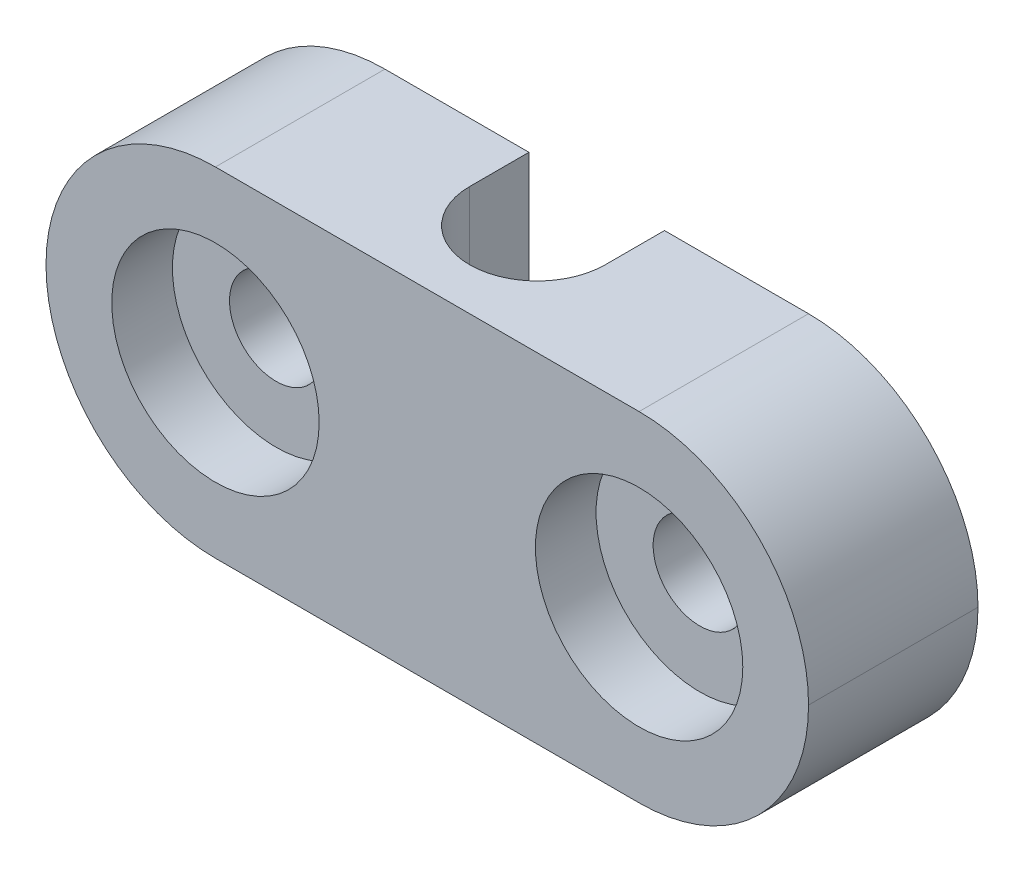
ISO-10303-21;
HEADER;
FILE_DESCRIPTION(('STEP AP214'),'2;1');
FILE_NAME('part.step','',(''),(''),'','','');
FILE_SCHEMA(('AUTOMOTIVE_DESIGN { 1 0 10303 214 1 1 1 1 }'));
ENDSEC;
DATA;
#1=APPLICATION_CONTEXT('core data for automotive mechanical design processes');
#2=APPLICATION_PROTOCOL_DEFINITION('international standard','automotive_design',2000,#1);
#3=PRODUCT_CONTEXT('',#1,'mechanical');
#4=PRODUCT('Part','Part','',(#3));
#5=PRODUCT_RELATED_PRODUCT_CATEGORY('part','',(#4));
#6=PRODUCT_DEFINITION_FORMATION('','',#4);
#7=PRODUCT_DEFINITION_CONTEXT('part definition',#1,'design');
#8=PRODUCT_DEFINITION('design','',#6,#7);
#9=PRODUCT_DEFINITION_SHAPE('','',#8);
#10=(LENGTH_UNIT() NAMED_UNIT(*) SI_UNIT(.MILLI.,.METRE.));
#11=(NAMED_UNIT(*) PLANE_ANGLE_UNIT() SI_UNIT($,.RADIAN.));
#12=(NAMED_UNIT(*) SI_UNIT($,.STERADIAN.) SOLID_ANGLE_UNIT());
#13=UNCERTAINTY_MEASURE_WITH_UNIT(LENGTH_MEASURE(1.E-05),#10,'distance_accuracy_value','');
#14=(GEOMETRIC_REPRESENTATION_CONTEXT(3) GLOBAL_UNCERTAINTY_ASSIGNED_CONTEXT((#13)) GLOBAL_UNIT_ASSIGNED_CONTEXT((#10,
#11,#12)) REPRESENTATION_CONTEXT('',''));
#15=CARTESIAN_POINT('',(0.,0.,0.));
#16=DIRECTION('',(0.,0.,1.));
#17=DIRECTION('',(1.,0.,0.));
#18=AXIS2_PLACEMENT_3D('',#15,#16,#17);
#19=CARTESIAN_POINT('',(0.,0.,0.));
#20=DIRECTION('',(0.,0.,-1.));
#21=DIRECTION('',(-1.,0.,0.));
#22=AXIS2_PLACEMENT_3D('',#19,#20,#21);
#23=PLANE('',#22);
#24=DIRECTION('',(0.,1.,0.));
#25=VECTOR('',#24,1.);
#26=CARTESIAN_POINT('',(-4.,0.,0.));
#27=LINE('',#26,#25);
#28=CARTESIAN_POINT('',(-4.,-10.,0.));
#29=VERTEX_POINT('',#28);
#30=CARTESIAN_POINT('',(-4.,10.,0.));
#31=VERTEX_POINT('',#30);
#32=EDGE_CURVE('E11',#29,#31,#27,.T.);
#33=ORIENTED_EDGE('',*,*,#32,.F.);
#34=DIRECTION('',(1.,0.,0.));
#35=VECTOR('',#34,1.);
#36=CARTESIAN_POINT('',(-22.5,-10.,0.));
#37=LINE('',#36,#35);
#38=CARTESIAN_POINT('',(-12.5,-10.,0.));
#39=VERTEX_POINT('',#38);
#40=EDGE_CURVE('E130',#39,#29,#37,.T.);
#41=ORIENTED_EDGE('',*,*,#40,.F.);
#42=CARTESIAN_POINT('',(-12.5,0.,0.));
#43=DIRECTION('',(0.,0.,-1.));
#44=DIRECTION('',(-1.,0.,0.));
#45=AXIS2_PLACEMENT_3D('',#42,#43,#44);
#46=CIRCLE('',#45,10.);
#47=CARTESIAN_POINT('',(-22.5,0.,0.));
#48=VERTEX_POINT('',#47);
#49=EDGE_CURVE('E145',#39,#48,#46,.T.);
#50=ORIENTED_EDGE('',*,*,#49,.T.);
#51=CARTESIAN_POINT('',(-12.5,0.,0.));
#52=DIRECTION('',(0.,0.,-1.));
#53=DIRECTION('',(-1.,0.,0.));
#54=AXIS2_PLACEMENT_3D('',#51,#52,#53);
#55=CIRCLE('',#54,10.);
#56=CARTESIAN_POINT('',(-12.5,10.,0.));
#57=VERTEX_POINT('',#56);
#58=EDGE_CURVE('E147',#48,#57,#55,.T.);
#59=ORIENTED_EDGE('',*,*,#58,.T.);
#60=DIRECTION('',(-1.,0.,0.));
#61=VECTOR('',#60,1.);
#62=CARTESIAN_POINT('',(-22.5,10.,0.));
#63=LINE('',#62,#61);
#64=EDGE_CURVE('E134',#31,#57,#63,.T.);
#65=ORIENTED_EDGE('',*,*,#64,.F.);
#66=EDGE_LOOP('',(#33,#41,#50,#59,#65));
#67=FACE_BOUND('',#66,.T.);
#68=CARTESIAN_POINT('',(-12.5,0.,0.));
#69=DIRECTION('',(0.,0.,1.));
#70=DIRECTION('',(1.,0.,0.));
#71=AXIS2_PLACEMENT_3D('',#68,#69,#70);
#72=CIRCLE('',#71,2.75);
#73=CARTESIAN_POINT('',(-9.75,0.,0.));
#74=VERTEX_POINT('',#73);
#75=EDGE_CURVE('E227',#74,#74,#72,.T.);
#76=ORIENTED_EDGE('',*,*,#75,.T.);
#77=EDGE_LOOP('',(#76));
#78=FACE_BOUND('',#77,.T.);
#79=ADVANCED_FACE('F34',(#67,#78),#23,.T.);
#80=CARTESIAN_POINT('',(-22.5,10.,10.));
#81=DIRECTION('',(0.,-1.,0.));
#82=DIRECTION('',(0.,0.,-1.));
#83=AXIS2_PLACEMENT_3D('',#80,#81,#82);
#84=PLANE('',#83);
#85=CARTESIAN_POINT('',(0.,10.,3.5));
#86=DIRECTION('',(0.,-1.,0.));
#87=DIRECTION('',(0.,0.,-1.));
#88=AXIS2_PLACEMENT_3D('',#85,#86,#87);
#89=CIRCLE('',#88,4.);
#90=CARTESIAN_POINT('',(4.,10.,3.5));
#91=VERTEX_POINT('',#90);
#92=CARTESIAN_POINT('',(-4.,10.,3.5));
#93=VERTEX_POINT('',#92);
#94=EDGE_CURVE('E169',#91,#93,#89,.T.);
#95=ORIENTED_EDGE('',*,*,#94,.T.);
#96=DIRECTION('',(0.,0.,-1.));
#97=VECTOR('',#96,1.);
#98=CARTESIAN_POINT('',(-4.,10.,10.));
#99=LINE('',#98,#97);
#100=EDGE_CURVE('E174',#93,#31,#99,.T.);
#101=ORIENTED_EDGE('',*,*,#100,.T.);
#102=ORIENTED_EDGE('',*,*,#64,.T.);
#103=DIRECTION('',(0.,0.,-1.));
#104=VECTOR('',#103,1.);
#105=CARTESIAN_POINT('',(-12.5,10.,10.));
#106=LINE('',#105,#104);
#107=CARTESIAN_POINT('',(-12.5,10.,10.));
#108=VERTEX_POINT('',#107);
#109=EDGE_CURVE('E138',#57,#108,#106,.F.);
#110=ORIENTED_EDGE('',*,*,#109,.T.);
#111=DIRECTION('',(-1.,0.,0.));
#112=VECTOR('',#111,1.);
#113=CARTESIAN_POINT('',(-22.5,10.,10.));
#114=LINE('',#113,#112);
#115=CARTESIAN_POINT('',(12.5,10.,10.));
#116=VERTEX_POINT('',#115);
#117=EDGE_CURVE('E133',#116,#108,#114,.T.);
#118=ORIENTED_EDGE('',*,*,#117,.F.);
#119=DIRECTION('',(0.,0.,-1.));
#120=VECTOR('',#119,1.);
#121=CARTESIAN_POINT('',(12.5,10.,10.));
#122=LINE('',#121,#120);
#123=CARTESIAN_POINT('',(12.5,10.,0.));
#124=VERTEX_POINT('',#123);
#125=EDGE_CURVE('E141',#116,#124,#122,.T.);
#126=ORIENTED_EDGE('',*,*,#125,.T.);
#127=CARTESIAN_POINT('',(3.99999999999999,10.,0.));
#128=VERTEX_POINT('',#127);
#129=EDGE_CURVE('E131',#124,#128,#63,.T.);
#130=ORIENTED_EDGE('',*,*,#129,.T.);
#131=DIRECTION('',(0.,0.,1.));
#132=VECTOR('',#131,1.);
#133=CARTESIAN_POINT('',(4.,10.,10.));
#134=LINE('',#133,#132);
#135=EDGE_CURVE('E49',#128,#91,#134,.T.);
#136=ORIENTED_EDGE('',*,*,#135,.T.);
#137=EDGE_LOOP('',(#95,#101,#102,#110,#118,#126,#130,#136));
#138=FACE_BOUND('',#137,.T.);
#139=ADVANCED_FACE('F195',(#138),#84,.F.);
#140=CARTESIAN_POINT('',(-22.5,-10.,10.));
#141=DIRECTION('',(0.,1.,0.));
#142=DIRECTION('',(0.,0.,1.));
#143=AXIS2_PLACEMENT_3D('',#140,#141,#142);
#144=PLANE('',#143);
#145=ORIENTED_EDGE('',*,*,#40,.T.);
#146=DIRECTION('',(0.,0.,-1.));
#147=VECTOR('',#146,1.);
#148=CARTESIAN_POINT('',(-4.,-10.,0.));
#149=LINE('',#148,#147);
#150=CARTESIAN_POINT('',(-4.,-10.,3.5));
#151=VERTEX_POINT('',#150);
#152=EDGE_CURVE('E208',#151,#29,#149,.T.);
#153=ORIENTED_EDGE('',*,*,#152,.F.);
#154=CARTESIAN_POINT('',(0.,-10.,3.5));
#155=DIRECTION('',(0.,-1.,0.));
#156=DIRECTION('',(0.,0.,-1.));
#157=AXIS2_PLACEMENT_3D('',#154,#155,#156);
#158=CIRCLE('',#157,4.);
#159=CARTESIAN_POINT('',(4.,-10.,3.5));
#160=VERTEX_POINT('',#159);
#161=EDGE_CURVE('E124',#160,#151,#158,.T.);
#162=ORIENTED_EDGE('',*,*,#161,.F.);
#163=DIRECTION('',(0.,0.,1.));
#164=VECTOR('',#163,1.);
#165=CARTESIAN_POINT('',(4.,-10.,0.));
#166=LINE('',#165,#164);
#167=CARTESIAN_POINT('',(4.,-10.,0.));
#168=VERTEX_POINT('',#167);
#169=EDGE_CURVE('E112',#168,#160,#166,.T.);
#170=ORIENTED_EDGE('',*,*,#169,.F.);
#171=CARTESIAN_POINT('',(12.5,-10.,0.));
#172=VERTEX_POINT('',#171);
#173=EDGE_CURVE('E120',#168,#172,#37,.T.);
#174=ORIENTED_EDGE('',*,*,#173,.T.);
#175=DIRECTION('',(0.,0.,-1.));
#176=VECTOR('',#175,1.);
#177=CARTESIAN_POINT('',(12.5,-10.,10.));
#178=LINE('',#177,#176);
#179=CARTESIAN_POINT('',(12.5,-10.,10.));
#180=VERTEX_POINT('',#179);
#181=EDGE_CURVE('E57',#172,#180,#178,.F.);
#182=ORIENTED_EDGE('',*,*,#181,.T.);
#183=DIRECTION('',(1.,0.,0.));
#184=VECTOR('',#183,1.);
#185=CARTESIAN_POINT('',(-22.5,-10.,10.));
#186=LINE('',#185,#184);
#187=CARTESIAN_POINT('',(-12.5,-10.,10.));
#188=VERTEX_POINT('',#187);
#189=EDGE_CURVE('E142',#188,#180,#186,.T.);
#190=ORIENTED_EDGE('',*,*,#189,.F.);
#191=DIRECTION('',(0.,0.,-1.));
#192=VECTOR('',#191,1.);
#193=CARTESIAN_POINT('',(-12.5,-10.,10.));
#194=LINE('',#193,#192);
#195=EDGE_CURVE('E161',#188,#39,#194,.T.);
#196=ORIENTED_EDGE('',*,*,#195,.T.);
#197=EDGE_LOOP('',(#145,#153,#162,#170,#174,#182,#190,#196));
#198=FACE_BOUND('',#197,.T.);
#199=ADVANCED_FACE('F119',(#198),#144,.F.);
#200=CARTESIAN_POINT('',(0.,0.,10.));
#201=DIRECTION('',(0.,0.,-1.));
#202=DIRECTION('',(-1.,0.,0.));
#203=AXIS2_PLACEMENT_3D('',#200,#201,#202);
#204=PLANE('',#203);
#205=CARTESIAN_POINT('',(-12.5,0.,10.));
#206=DIRECTION('',(0.,0.,1.));
#207=DIRECTION('',(1.,0.,0.));
#208=AXIS2_PLACEMENT_3D('',#205,#206,#207);
#209=CIRCLE('',#208,6.12);
#210=CARTESIAN_POINT('',(-6.38,0.,10.));
#211=VERTEX_POINT('',#210);
#212=EDGE_CURVE('E236',#211,#211,#209,.T.);
#213=ORIENTED_EDGE('',*,*,#212,.F.);
#214=EDGE_LOOP('',(#213));
#215=FACE_BOUND('',#214,.T.);
#216=CARTESIAN_POINT('',(12.5,0.,10.));
#217=DIRECTION('',(0.,0.,1.));
#218=DIRECTION('',(1.,0.,0.));
#219=AXIS2_PLACEMENT_3D('',#216,#217,#218);
#220=CIRCLE('',#219,6.12);
#221=CARTESIAN_POINT('',(18.62,0.,10.));
#222=VERTEX_POINT('',#221);
#223=EDGE_CURVE('E224',#222,#222,#220,.T.);
#224=ORIENTED_EDGE('',*,*,#223,.F.);
#225=EDGE_LOOP('',(#224));
#226=FACE_BOUND('',#225,.T.);
#227=CARTESIAN_POINT('',(12.5,0.,10.));
#228=DIRECTION('',(0.,0.,-1.));
#229=DIRECTION('',(-1.,0.,0.));
#230=AXIS2_PLACEMENT_3D('',#227,#228,#229);
#231=CIRCLE('',#230,10.);
#232=CARTESIAN_POINT('',(22.5,0.,10.));
#233=VERTEX_POINT('',#232);
#234=EDGE_CURVE('E157',#180,#233,#231,.F.);
#235=ORIENTED_EDGE('',*,*,#234,.T.);
#236=CARTESIAN_POINT('',(12.5,0.,10.));
#237=DIRECTION('',(0.,0.,-1.));
#238=DIRECTION('',(-1.,0.,0.));
#239=AXIS2_PLACEMENT_3D('',#236,#237,#238);
#240=CIRCLE('',#239,10.);
#241=EDGE_CURVE('E159',#233,#116,#240,.F.);
#242=ORIENTED_EDGE('',*,*,#241,.T.);
#243=ORIENTED_EDGE('',*,*,#117,.T.);
#244=CARTESIAN_POINT('',(-12.5,0.,10.));
#245=DIRECTION('',(0.,0.,-1.));
#246=DIRECTION('',(-1.,0.,0.));
#247=AXIS2_PLACEMENT_3D('',#244,#245,#246);
#248=CIRCLE('',#247,10.);
#249=CARTESIAN_POINT('',(-22.5,0.,10.));
#250=VERTEX_POINT('',#249);
#251=EDGE_CURVE('E155',#108,#250,#248,.F.);
#252=ORIENTED_EDGE('',*,*,#251,.T.);
#253=CARTESIAN_POINT('',(-12.5,0.,10.));
#254=DIRECTION('',(0.,0.,-1.));
#255=DIRECTION('',(-1.,0.,0.));
#256=AXIS2_PLACEMENT_3D('',#253,#254,#255);
#257=CIRCLE('',#256,10.);
#258=EDGE_CURVE('E153',#250,#188,#257,.F.);
#259=ORIENTED_EDGE('',*,*,#258,.T.);
#260=ORIENTED_EDGE('',*,*,#189,.T.);
#261=EDGE_LOOP('',(#235,#242,#243,#252,#259,#260));
#262=FACE_BOUND('',#261,.T.);
#263=ADVANCED_FACE('F184',(#215,#226,#262),#204,.F.);
#264=CARTESIAN_POINT('',(12.5,0.,0.));
#265=DIRECTION('',(0.,0.,1.));
#266=DIRECTION('',(1.,0.,0.));
#267=AXIS2_PLACEMENT_3D('',#264,#265,#266);
#268=CIRCLE('',#267,2.75);
#269=CARTESIAN_POINT('',(15.25,0.,0.));
#270=VERTEX_POINT('',#269);
#271=EDGE_CURVE('E125',#270,#270,#268,.T.);
#272=ORIENTED_EDGE('',*,*,#271,.T.);
#273=EDGE_LOOP('',(#272));
#274=FACE_BOUND('',#273,.T.);
#275=DIRECTION('',(0.,-1.,0.));
#276=VECTOR('',#275,1.);
#277=CARTESIAN_POINT('',(4.,0.,0.));
#278=LINE('',#277,#276);
#279=EDGE_CURVE('E42',#128,#168,#278,.T.);
#280=ORIENTED_EDGE('',*,*,#279,.F.);
#281=ORIENTED_EDGE('',*,*,#129,.F.);
#282=CARTESIAN_POINT('',(12.5,0.,0.));
#283=DIRECTION('',(0.,0.,-1.));
#284=DIRECTION('',(-1.,0.,0.));
#285=AXIS2_PLACEMENT_3D('',#282,#283,#284);
#286=CIRCLE('',#285,10.);
#287=CARTESIAN_POINT('',(22.5,0.,0.));
#288=VERTEX_POINT('',#287);
#289=EDGE_CURVE('E151',#124,#288,#286,.T.);
#290=ORIENTED_EDGE('',*,*,#289,.T.);
#291=CARTESIAN_POINT('',(12.5,0.,0.));
#292=DIRECTION('',(0.,0.,-1.));
#293=DIRECTION('',(-1.,0.,0.));
#294=AXIS2_PLACEMENT_3D('',#291,#292,#293);
#295=CIRCLE('',#294,10.);
#296=EDGE_CURVE('E129',#288,#172,#295,.T.);
#297=ORIENTED_EDGE('',*,*,#296,.T.);
#298=ORIENTED_EDGE('',*,*,#173,.F.);
#299=EDGE_LOOP('',(#280,#281,#290,#297,#298));
#300=FACE_BOUND('',#299,.T.);
#301=ADVANCED_FACE('F127',(#274,#300),#23,.T.);
#302=CARTESIAN_POINT('',(12.5,0.,10.));
#303=DIRECTION('',(0.,0.,-1.));
#304=DIRECTION('',(-1.,0.,0.));
#305=AXIS2_PLACEMENT_3D('',#302,#303,#304);
#306=CYLINDRICAL_SURFACE('',#305,10.);
#307=DIRECTION('',(0.,0.,-1.));
#308=VECTOR('',#307,1.);
#309=CARTESIAN_POINT('',(22.5,0.,10.));
#310=LINE('',#309,#308);
#311=EDGE_CURVE('E164',#233,#288,#310,.T.);
#312=ORIENTED_EDGE('',*,*,#311,.F.);
#313=ORIENTED_EDGE('',*,*,#234,.F.);
#314=ORIENTED_EDGE('',*,*,#181,.F.);
#315=ORIENTED_EDGE('',*,*,#296,.F.);
#316=EDGE_LOOP('',(#312,#313,#314,#315));
#317=FACE_BOUND('',#316,.T.);
#318=ADVANCED_FACE('F189',(#317),#306,.T.);
#319=CARTESIAN_POINT('',(12.5,0.,10.));
#320=DIRECTION('',(0.,0.,-1.));
#321=DIRECTION('',(-1.,0.,0.));
#322=AXIS2_PLACEMENT_3D('',#319,#320,#321);
#323=CYLINDRICAL_SURFACE('',#322,10.);
#324=ORIENTED_EDGE('',*,*,#241,.F.);
#325=ORIENTED_EDGE('',*,*,#311,.T.);
#326=ORIENTED_EDGE('',*,*,#289,.F.);
#327=ORIENTED_EDGE('',*,*,#125,.F.);
#328=EDGE_LOOP('',(#324,#325,#326,#327));
#329=FACE_BOUND('',#328,.T.);
#330=ADVANCED_FACE('F193',(#329),#323,.T.);
#331=CARTESIAN_POINT('',(-12.5,0.,10.));
#332=DIRECTION('',(0.,0.,-1.));
#333=DIRECTION('',(-1.,0.,0.));
#334=AXIS2_PLACEMENT_3D('',#331,#332,#333);
#335=CYLINDRICAL_SURFACE('',#334,10.);
#336=ORIENTED_EDGE('',*,*,#195,.F.);
#337=ORIENTED_EDGE('',*,*,#258,.F.);
#338=DIRECTION('',(0.,0.,-1.));
#339=VECTOR('',#338,1.);
#340=CARTESIAN_POINT('',(-22.5,0.,10.));
#341=LINE('',#340,#339);
#342=EDGE_CURVE('E167',#48,#250,#341,.F.);
#343=ORIENTED_EDGE('',*,*,#342,.F.);
#344=ORIENTED_EDGE('',*,*,#49,.F.);
#345=EDGE_LOOP('',(#336,#337,#343,#344));
#346=FACE_BOUND('',#345,.T.);
#347=ADVANCED_FACE('F36',(#346),#335,.T.);
#348=CARTESIAN_POINT('',(-12.5,0.,10.));
#349=DIRECTION('',(0.,0.,-1.));
#350=DIRECTION('',(-1.,0.,0.));
#351=AXIS2_PLACEMENT_3D('',#348,#349,#350);
#352=CYLINDRICAL_SURFACE('',#351,10.);
#353=ORIENTED_EDGE('',*,*,#251,.F.);
#354=ORIENTED_EDGE('',*,*,#109,.F.);
#355=ORIENTED_EDGE('',*,*,#58,.F.);
#356=ORIENTED_EDGE('',*,*,#342,.T.);
#357=EDGE_LOOP('',(#353,#354,#355,#356));
#358=FACE_BOUND('',#357,.T.);
#359=ADVANCED_FACE('F198',(#358),#352,.T.);
#360=CARTESIAN_POINT('',(0.,12.,3.5));
#361=DIRECTION('',(0.,-1.,0.));
#362=DIRECTION('',(0.,0.,-1.));
#363=AXIS2_PLACEMENT_3D('',#360,#361,#362);
#364=CYLINDRICAL_SURFACE('',#363,4.);
#365=DIRECTION('',(0.,-1.,0.));
#366=VECTOR('',#365,1.);
#367=CARTESIAN_POINT('',(4.,12.,3.5));
#368=LINE('',#367,#366);
#369=EDGE_CURVE('E210',#91,#160,#368,.T.);
#370=ORIENTED_EDGE('',*,*,#369,.T.);
#371=ORIENTED_EDGE('',*,*,#161,.T.);
#372=DIRECTION('',(0.,-1.,0.));
#373=VECTOR('',#372,1.);
#374=CARTESIAN_POINT('',(-4.,12.,3.5));
#375=LINE('',#374,#373);
#376=EDGE_CURVE('E209',#93,#151,#375,.T.);
#377=ORIENTED_EDGE('',*,*,#376,.F.);
#378=ORIENTED_EDGE('',*,*,#94,.F.);
#379=EDGE_LOOP('',(#370,#371,#377,#378));
#380=FACE_BOUND('',#379,.T.);
#381=ADVANCED_FACE('F291',(#380),#364,.F.);
#382=CARTESIAN_POINT('',(-4.,12.,0.));
#383=DIRECTION('',(-1.,0.,0.));
#384=DIRECTION('',(0.,0.,1.));
#385=AXIS2_PLACEMENT_3D('',#382,#383,#384);
#386=PLANE('',#385);
#387=ORIENTED_EDGE('',*,*,#376,.T.);
#388=ORIENTED_EDGE('',*,*,#152,.T.);
#389=ORIENTED_EDGE('',*,*,#32,.T.);
#390=ORIENTED_EDGE('',*,*,#100,.F.);
#391=EDGE_LOOP('',(#387,#388,#389,#390));
#392=FACE_BOUND('',#391,.T.);
#393=ADVANCED_FACE('F206',(#392),#386,.F.);
#394=CARTESIAN_POINT('',(4.,12.,0.));
#395=DIRECTION('',(1.,0.,0.));
#396=DIRECTION('',(0.,0.,-1.));
#397=AXIS2_PLACEMENT_3D('',#394,#395,#396);
#398=PLANE('',#397);
#399=ORIENTED_EDGE('',*,*,#279,.T.);
#400=ORIENTED_EDGE('',*,*,#169,.T.);
#401=ORIENTED_EDGE('',*,*,#369,.F.);
#402=ORIENTED_EDGE('',*,*,#135,.F.);
#403=EDGE_LOOP('',(#399,#400,#401,#402));
#404=FACE_BOUND('',#403,.T.);
#405=ADVANCED_FACE('F111',(#404),#398,.F.);
#406=CARTESIAN_POINT('',(12.5,0.,10.));
#407=DIRECTION('',(0.,0.,1.));
#408=DIRECTION('',(1.,0.,0.));
#409=AXIS2_PLACEMENT_3D('',#406,#407,#408);
#410=CYLINDRICAL_SURFACE('',#409,2.75);
#411=ORIENTED_EDGE('',*,*,#271,.F.);
#412=EDGE_LOOP('',(#411));
#413=FACE_BOUND('',#412,.T.);
#414=CARTESIAN_POINT('',(12.5,0.,6.42));
#415=DIRECTION('',(0.,0.,1.));
#416=DIRECTION('',(1.,0.,0.));
#417=AXIS2_PLACEMENT_3D('',#414,#415,#416);
#418=CIRCLE('',#417,2.75);
#419=CARTESIAN_POINT('',(15.25,0.,6.42));
#420=VERTEX_POINT('',#419);
#421=EDGE_CURVE('E218',#420,#420,#418,.T.);
#422=ORIENTED_EDGE('',*,*,#421,.T.);
#423=EDGE_LOOP('',(#422));
#424=FACE_BOUND('',#423,.T.);
#425=ADVANCED_FACE('F260',(#413,#424),#410,.F.);
#426=CARTESIAN_POINT('',(15.25,0.,6.42));
#427=DIRECTION('',(0.,0.,-1.));
#428=DIRECTION('',(-1.,0.,0.));
#429=AXIS2_PLACEMENT_3D('',#426,#427,#428);
#430=PLANE('',#429);
#431=ORIENTED_EDGE('',*,*,#421,.F.);
#432=EDGE_LOOP('',(#431));
#433=FACE_BOUND('',#432,.T.);
#434=CARTESIAN_POINT('',(12.5,0.,6.42));
#435=DIRECTION('',(0.,0.,1.));
#436=DIRECTION('',(1.,0.,0.));
#437=AXIS2_PLACEMENT_3D('',#434,#435,#436);
#438=CIRCLE('',#437,6.12);
#439=CARTESIAN_POINT('',(18.62,0.,6.42));
#440=VERTEX_POINT('',#439);
#441=EDGE_CURVE('E221',#440,#440,#438,.T.);
#442=ORIENTED_EDGE('',*,*,#441,.T.);
#443=EDGE_LOOP('',(#442));
#444=FACE_BOUND('',#443,.T.);
#445=ADVANCED_FACE('F250',(#433,#444),#430,.F.);
#446=CARTESIAN_POINT('',(12.5,0.,10.));
#447=DIRECTION('',(0.,0.,1.));
#448=DIRECTION('',(1.,0.,0.));
#449=AXIS2_PLACEMENT_3D('',#446,#447,#448);
#450=CYLINDRICAL_SURFACE('',#449,6.12);
#451=ORIENTED_EDGE('',*,*,#441,.F.);
#452=EDGE_LOOP('',(#451));
#453=FACE_BOUND('',#452,.T.);
#454=ORIENTED_EDGE('',*,*,#223,.T.);
#455=EDGE_LOOP('',(#454));
#456=FACE_BOUND('',#455,.T.);
#457=ADVANCED_FACE('F247',(#453,#456),#450,.F.);
#458=CARTESIAN_POINT('',(-12.5,0.,10.));
#459=DIRECTION('',(0.,0.,1.));
#460=DIRECTION('',(1.,0.,0.));
#461=AXIS2_PLACEMENT_3D('',#458,#459,#460);
#462=CYLINDRICAL_SURFACE('',#461,2.75);
#463=ORIENTED_EDGE('',*,*,#75,.F.);
#464=EDGE_LOOP('',(#463));
#465=FACE_BOUND('',#464,.T.);
#466=CARTESIAN_POINT('',(-12.5,0.,6.42));
#467=DIRECTION('',(0.,0.,1.));
#468=DIRECTION('',(1.,0.,0.));
#469=AXIS2_PLACEMENT_3D('',#466,#467,#468);
#470=CIRCLE('',#469,2.75);
#471=CARTESIAN_POINT('',(-9.75,0.,6.42));
#472=VERTEX_POINT('',#471);
#473=EDGE_CURVE('E230',#472,#472,#470,.T.);
#474=ORIENTED_EDGE('',*,*,#473,.T.);
#475=EDGE_LOOP('',(#474));
#476=FACE_BOUND('',#475,.T.);
#477=ADVANCED_FACE('F249',(#465,#476),#462,.F.);
#478=CARTESIAN_POINT('',(-9.75,0.,6.42));
#479=DIRECTION('',(0.,0.,-1.));
#480=DIRECTION('',(-1.,0.,0.));
#481=AXIS2_PLACEMENT_3D('',#478,#479,#480);
#482=PLANE('',#481);
#483=ORIENTED_EDGE('',*,*,#473,.F.);
#484=EDGE_LOOP('',(#483));
#485=FACE_BOUND('',#484,.T.);
#486=CARTESIAN_POINT('',(-12.5,0.,6.42));
#487=DIRECTION('',(0.,0.,1.));
#488=DIRECTION('',(1.,0.,0.));
#489=AXIS2_PLACEMENT_3D('',#486,#487,#488);
#490=CIRCLE('',#489,6.12);
#491=CARTESIAN_POINT('',(-6.38,0.,6.42));
#492=VERTEX_POINT('',#491);
#493=EDGE_CURVE('E233',#492,#492,#490,.T.);
#494=ORIENTED_EDGE('',*,*,#493,.T.);
#495=EDGE_LOOP('',(#494));
#496=FACE_BOUND('',#495,.T.);
#497=ADVANCED_FACE('F257',(#485,#496),#482,.F.);
#498=CARTESIAN_POINT('',(-12.5,0.,10.));
#499=DIRECTION('',(0.,0.,1.));
#500=DIRECTION('',(1.,0.,0.));
#501=AXIS2_PLACEMENT_3D('',#498,#499,#500);
#502=CYLINDRICAL_SURFACE('',#501,6.12);
#503=ORIENTED_EDGE('',*,*,#493,.F.);
#504=EDGE_LOOP('',(#503));
#505=FACE_BOUND('',#504,.T.);
#506=ORIENTED_EDGE('',*,*,#212,.T.);
#507=EDGE_LOOP('',(#506));
#508=FACE_BOUND('',#507,.T.);
#509=ADVANCED_FACE('F240',(#505,#508),#502,.F.);
#510=CLOSED_SHELL('',(#79,#139,#199,#263,#301,#318,#330,#347,#359,#381,#393,#405,#425,#445,#457,
#477,#497,#509));
#511=MANIFOLD_SOLID_BREP('B2',#510);
#512=ADVANCED_BREP_SHAPE_REPRESENTATION('',(#18,#511),#14);
#513=SHAPE_DEFINITION_REPRESENTATION(#9,#512);
ENDSEC;
END-ISO-10303-21;
